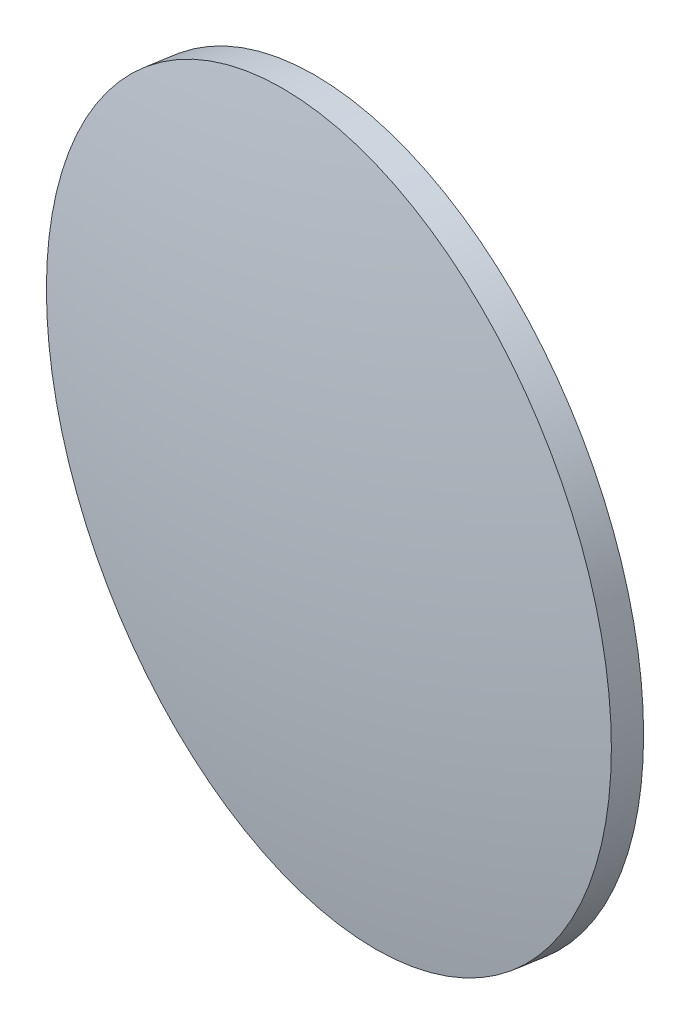
ISO-10303-21;
HEADER;
FILE_DESCRIPTION(('STEP AP214'),'2;1');
FILE_NAME('part.step','',(''),(''),'','','');
FILE_SCHEMA(('AUTOMOTIVE_DESIGN { 1 0 10303 214 1 1 1 1 }'));
ENDSEC;
DATA;
#1=APPLICATION_CONTEXT('core data for automotive mechanical design processes');
#2=APPLICATION_PROTOCOL_DEFINITION('international standard','automotive_design',2000,#1);
#3=PRODUCT_CONTEXT('',#1,'mechanical');
#4=PRODUCT('Part','Part','',(#3));
#5=PRODUCT_RELATED_PRODUCT_CATEGORY('part','',(#4));
#6=PRODUCT_DEFINITION_FORMATION('','',#4);
#7=PRODUCT_DEFINITION_CONTEXT('part definition',#1,'design');
#8=PRODUCT_DEFINITION('design','',#6,#7);
#9=PRODUCT_DEFINITION_SHAPE('','',#8);
#10=(LENGTH_UNIT() NAMED_UNIT(*) SI_UNIT(.MILLI.,.METRE.));
#11=(NAMED_UNIT(*) PLANE_ANGLE_UNIT() SI_UNIT($,.RADIAN.));
#12=(NAMED_UNIT(*) SI_UNIT($,.STERADIAN.) SOLID_ANGLE_UNIT());
#13=UNCERTAINTY_MEASURE_WITH_UNIT(LENGTH_MEASURE(1.E-05),#10,'distance_accuracy_value','');
#14=(GEOMETRIC_REPRESENTATION_CONTEXT(3) GLOBAL_UNCERTAINTY_ASSIGNED_CONTEXT((#13)) GLOBAL_UNIT_ASSIGNED_CONTEXT((#10,
#11,#12)) REPRESENTATION_CONTEXT('',''));
#15=CARTESIAN_POINT('',(0.,0.,0.));
#16=DIRECTION('',(0.,0.,1.));
#17=DIRECTION('',(1.,0.,0.));
#18=AXIS2_PLACEMENT_3D('',#15,#16,#17);
#19=CARTESIAN_POINT('',(0.,1.04083408558608E-13,-300.));
#20=DIRECTION('',(0.,1.,0.));
#21=DIRECTION('',(-0.32867109906109,0.,0.944444444444444));
#22=AXIS2_PLACEMENT_3D('',#19,#20,#21);
#23=SPHERICAL_SURFACE('',#22,304.);
#24=CARTESIAN_POINT('',(0.,1.04083408558608E-13,-300.));
#25=DIRECTION('',(0.166666666666666,0.,-0.986013297183269));
#26=DIRECTION('',(-0.986013297183269,0.,-0.166666666666666));
#27=AXIS2_PLACEMENT_3D('',#24,#25,#26);
#28=SPHERICAL_SURFACE('',#27,304.);
#29=CARTESIAN_POINT('',(-49.9766612196799,0.,-4.33408493143256));
#30=DIRECTION('',(0.166666666666666,0.,-0.986013297183269));
#31=DIRECTION('',(-0.986013297183269,0.,-0.166666666666666));
#32=AXIS2_PLACEMENT_3D('',#29,#30,#31);
#33=CIRCLE('',#32,50.);
#34=CARTESIAN_POINT('',(-99.2773260788434,0.,-12.6674182647659));
#35=VERTEX_POINT('',#34);
#36=EDGE_CURVE('E37',#35,#35,#33,.F.);
#37=ORIENTED_EDGE('',*,*,#36,.T.);
#38=EDGE_LOOP('',(#37));
#39=FACE_BOUND('',#38,.T.);
#40=ADVANCED_FACE('F31',(#39),#28,.T.);
#41=CARTESIAN_POINT('',(-45.9104938271604,0.,-28.3898556370161));
#42=DIRECTION('',(-0.166666666666666,0.,0.986013297183269));
#43=DIRECTION('',(0.98601329718327,0.,0.166666666666666));
#44=AXIS2_PLACEMENT_3D('',#41,#42,#43);
#45=CYLINDRICAL_SURFACE('',#44,50.);
#46=ORIENTED_EDGE('',*,*,#36,.F.);
#47=EDGE_LOOP('',(#46));
#48=FACE_BOUND('',#47,.T.);
#49=CARTESIAN_POINT('',(-49.3006648591634,0.,-8.33333333333319));
#50=DIRECTION('',(0.166666666666666,0.,-0.986013297183269));
#51=DIRECTION('',(-0.986013297183269,0.,-0.166666666666666));
#52=AXIS2_PLACEMENT_3D('',#49,#50,#51);
#53=CIRCLE('',#52,50.);
#54=CARTESIAN_POINT('',(-98.6013297183269,0.,-16.6666666666665));
#55=VERTEX_POINT('',#54);
#56=EDGE_CURVE('E10',#55,#55,#53,.T.);
#57=ORIENTED_EDGE('',*,*,#56,.F.);
#58=EDGE_LOOP('',(#57));
#59=FACE_BOUND('',#58,.T.);
#60=ADVANCED_FACE('F44',(#48,#59),#45,.T.);
#61=CARTESIAN_POINT('',(0.,1.04083408558608E-13,-300.));
#62=DIRECTION('',(0.,1.,0.));
#63=DIRECTION('',(-0.32867109906109,0.,0.944444444444444));
#64=AXIS2_PLACEMENT_3D('',#61,#62,#63);
#65=SPHERICAL_SURFACE('',#64,300.);
#66=CARTESIAN_POINT('',(0.,1.04083408558608E-13,-300.));
#67=DIRECTION('',(0.166666666666666,0.,-0.986013297183269));
#68=DIRECTION('',(-0.986013297183269,0.,-0.166666666666666));
#69=AXIS2_PLACEMENT_3D('',#66,#67,#68);
#70=SPHERICAL_SURFACE('',#69,300.);
#71=ORIENTED_EDGE('',*,*,#56,.T.);
#72=EDGE_LOOP('',(#71));
#73=FACE_BOUND('',#72,.T.);
#74=ADVANCED_FACE('F47',(#73),#70,.F.);
#75=CLOSED_SHELL('',(#40,#60,#74));
#76=MANIFOLD_SOLID_BREP('B2',#75);
#77=ADVANCED_BREP_SHAPE_REPRESENTATION('',(#18,#76),#14);
#78=SHAPE_DEFINITION_REPRESENTATION(#9,#77);
ENDSEC;
END-ISO-10303-21;
